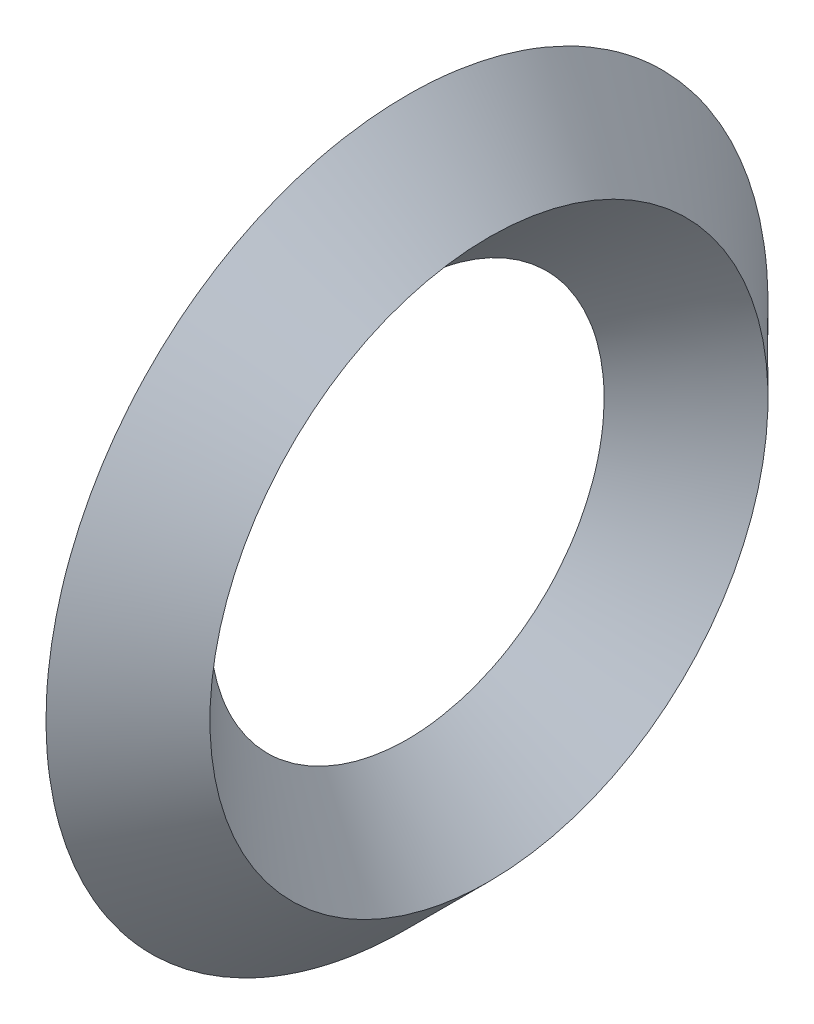
ISO-10303-21;
HEADER;
FILE_DESCRIPTION(('STEP AP214'),'2;1');
FILE_NAME('part.step','',(''),(''),'','','');
FILE_SCHEMA(('AUTOMOTIVE_DESIGN { 1 0 10303 214 1 1 1 1 }'));
ENDSEC;
DATA;
#1=APPLICATION_CONTEXT('core data for automotive mechanical design processes');
#2=APPLICATION_PROTOCOL_DEFINITION('international standard','automotive_design',2000,#1);
#3=PRODUCT_CONTEXT('',#1,'mechanical');
#4=PRODUCT('Part','Part','',(#3));
#5=PRODUCT_RELATED_PRODUCT_CATEGORY('part','',(#4));
#6=PRODUCT_DEFINITION_FORMATION('','',#4);
#7=PRODUCT_DEFINITION_CONTEXT('part definition',#1,'design');
#8=PRODUCT_DEFINITION('design','',#6,#7);
#9=PRODUCT_DEFINITION_SHAPE('','',#8);
#10=(LENGTH_UNIT() NAMED_UNIT(*) SI_UNIT(.MILLI.,.METRE.));
#11=(NAMED_UNIT(*) PLANE_ANGLE_UNIT() SI_UNIT($,.RADIAN.));
#12=(NAMED_UNIT(*) SI_UNIT($,.STERADIAN.) SOLID_ANGLE_UNIT());
#13=UNCERTAINTY_MEASURE_WITH_UNIT(LENGTH_MEASURE(1.E-05),#10,'distance_accuracy_value','');
#14=(GEOMETRIC_REPRESENTATION_CONTEXT(3) GLOBAL_UNCERTAINTY_ASSIGNED_CONTEXT((#13)) GLOBAL_UNIT_ASSIGNED_CONTEXT((#10,
#11,#12)) REPRESENTATION_CONTEXT('',''));
#15=CARTESIAN_POINT('',(0.,0.,0.));
#16=DIRECTION('',(0.,0.,1.));
#17=DIRECTION('',(1.,0.,0.));
#18=AXIS2_PLACEMENT_3D('',#15,#16,#17);
#19=CARTESIAN_POINT('',(88.4999999999999,44.0508926813987,46.4275656692434));
#20=DIRECTION('',(-1.,0.,0.));
#21=DIRECTION('',(0.,0.97238902572085,-0.233365770107049));
#22=AXIS2_PLACEMENT_3D('',#19,#20,#21);
#23=CONICAL_SURFACE('',#22,8.50000000000004,0.785398163397453);
#24=CARTESIAN_POINT('',(90.4999999999999,44.0508926813987,46.4275656692434));
#25=DIRECTION('',(1.,0.,0.));
#26=DIRECTION('',(0.,-0.97238902572085,0.233365770107049));
#27=AXIS2_PLACEMENT_3D('',#24,#25,#26);
#28=CIRCLE('',#27,6.5);
#29=CARTESIAN_POINT('',(90.4999999999999,37.7303640142132,47.9444431749392));
#30=VERTEX_POINT('',#29);
#31=EDGE_CURVE('E48',#30,#30,#28,.F.);
#32=ORIENTED_EDGE('',*,*,#31,.T.);
#33=EDGE_LOOP('',(#32));
#34=FACE_BOUND('',#33,.T.);
#35=CARTESIAN_POINT('',(88.5908116907946,35.6417043722034,46.4275656693589));
#36=CARTESIAN_POINT('',(88.5908117935183,35.6417025529571,46.6625204245041));
#37=CARTESIAN_POINT('',(88.5909903129111,35.6517341173683,46.8974451577782));
#38=CARTESIAN_POINT('',(88.5915270851731,35.6916126202227,47.3656833069674));
#39=CARTESIAN_POINT('',(88.5918853888673,35.7214651628265,47.5989962483102));
#40=CARTESIAN_POINT('',(88.592628514165,35.8006838280418,48.0625973765442));
#41=CARTESIAN_POINT('',(88.5930133704048,35.8500758519243,48.2928811276142));
#42=CARTESIAN_POINT('',(88.5936901003344,35.9679119045025,48.7485225020141));
#43=CARTESIAN_POINT('',(88.5939819729496,36.0363561533455,48.9738800683898));
#44=CARTESIAN_POINT('',(88.5943956059712,36.1918665651528,49.4184579246521));
#45=CARTESIAN_POINT('',(88.5945171079108,36.2789607915042,49.6376683962511));
#46=CARTESIAN_POINT('',(88.5945580677103,36.4710792019369,50.0680912028688));
#47=CARTESIAN_POINT('',(88.5944775215272,36.5761037447777,50.2793033777499));
#48=CARTESIAN_POINT('',(88.594131838259,36.8033152257449,50.692156138085));
#49=CARTESIAN_POINT('',(88.5938667888803,36.925493987334,50.893801222771));
#50=CARTESIAN_POINT('',(88.5932233504776,37.1862605017927,51.2861879771424));
#51=CARTESIAN_POINT('',(88.5928449614947,37.3248482486981,51.4769296507908));
#52=CARTESIAN_POINT('',(88.5920814785049,37.6191866571651,51.8481734460824));
#53=CARTESIAN_POINT('',(88.5916963568148,37.7751117428974,52.0285373872655));
#54=CARTESIAN_POINT('',(88.5911327591758,38.1018534420126,52.3752305876525));
#55=CARTESIAN_POINT('',(88.5909542798688,38.2726698133496,52.5415600748887));
#56=CARTESIAN_POINT('',(88.590808211624,38.6279588513917,52.8589768576582));
#57=CARTESIAN_POINT('',(88.590840651792,38.8124333993849,53.0100620466324));
#58=CARTESIAN_POINT('',(88.5909110564927,39.1935485054108,53.296025694256));
#59=CARTESIAN_POINT('',(88.5909490212443,39.3901895451777,53.4309035105489));
#60=CARTESIAN_POINT('',(88.5909199484937,39.7916692358965,53.6820134101824));
#61=CARTESIAN_POINT('',(88.5908541985046,39.9963770897802,53.7984546850033));
#62=CARTESIAN_POINT('',(88.5906928557904,40.4148218907859,54.013790030883));
#63=CARTESIAN_POINT('',(88.590597263586,40.6285586803246,54.1126844080339));
#64=CARTESIAN_POINT('',(88.590446993046,41.0635690280475,54.2921595017764));
#65=CARTESIAN_POINT('',(88.5903923114005,41.2848419750113,54.3727416995304));
#66=CARTESIAN_POINT('',(88.590371491757,41.7333925074914,54.5149882022783));
#67=CARTESIAN_POINT('',(88.5904053553882,41.9606702034218,54.5766521591439));
#68=CARTESIAN_POINT('',(88.5905400321984,42.4204436279788,54.6808327346117));
#69=CARTESIAN_POINT('',(88.5906410895935,42.6529553905895,54.7232785553827));
#70=CARTESIAN_POINT('',(88.5907734151149,43.1207175577709,54.7885244388753));
#71=CARTESIAN_POINT('',(88.5908046830419,43.3559679701582,54.8113244455102));
#72=CARTESIAN_POINT('',(88.5908279359625,43.8275720465709,54.8370884914812));
#73=CARTESIAN_POINT('',(88.5908199181315,44.0639257887012,54.8400511045457));
#74=CARTESIAN_POINT('',(88.590806543156,44.5360435153194,54.8260736979924));
#75=CARTESIAN_POINT('',(88.5908011860268,44.7718074963978,54.8091335635798));
#76=CARTESIAN_POINT('',(88.590702953286,45.2417188326261,54.7554875904507));
#77=CARTESIAN_POINT('',(88.59060984246,45.4758601387001,54.7187287431727));
#78=CARTESIAN_POINT('',(88.5904645502763,45.9401968400797,54.6255463644184));
#79=CARTESIAN_POINT('',(88.5904123683543,46.1703922897504,54.5691231041028));
#80=CARTESIAN_POINT('',(88.5903947098766,46.6251576404744,54.436978011009));
#81=CARTESIAN_POINT('',(88.5904292273206,46.8497279297538,54.3612575141019));
#82=CARTESIAN_POINT('',(88.5905306581666,47.2916701702566,54.1911088789451));
#83=CARTESIAN_POINT('',(88.5905975723144,47.509041955662,54.0966803101031));
#84=CARTESIAN_POINT('',(88.5907209681529,47.9344081491954,53.8901398090537));
#85=CARTESIAN_POINT('',(88.5907774805433,48.1424287366953,53.7780817849006));
#86=CARTESIAN_POINT('',(88.5908851588626,48.548306905759,53.5368699075306));
#87=CARTESIAN_POINT('',(88.5909363248615,48.7461646204687,53.4077162783662));
#88=CARTESIAN_POINT('',(88.591032845992,49.1302978497929,53.1332416122686));
#89=CARTESIAN_POINT('',(88.5910782017154,49.3165745429337,52.987922224633));
#90=CARTESIAN_POINT('',(88.5911417784243,49.6763253337487,52.6820969186211));
#91=CARTESIAN_POINT('',(88.5911599899146,49.8497949313331,52.5215857070035));
#92=CARTESIAN_POINT('',(88.5911571744421,50.1829722881246,52.1862300580103));
#93=CARTESIAN_POINT('',(88.5911360695916,50.3426520731478,52.0113578268202));
#94=CARTESIAN_POINT('',(88.5910682446411,50.6467232561822,51.6487851536203));
#95=CARTESIAN_POINT('',(88.5910215240483,50.7911143599519,51.4610844648321));
#96=CARTESIAN_POINT('',(88.5909234705253,51.063550991631,51.0741949190078));
#97=CARTESIAN_POINT('',(88.5908721379514,51.1915977802475,50.8750069497576));
#98=CARTESIAN_POINT('',(88.5907634235052,51.4304499668258,50.466546643098));
#99=CARTESIAN_POINT('',(88.5907060415741,51.5412551974503,50.25727420784));
#100=CARTESIAN_POINT('',(88.5905815792056,51.7448492243023,49.8301140958957));
#101=CARTESIAN_POINT('',(88.5905144977486,51.8376361239934,49.6122255152109));
#102=CARTESIAN_POINT('',(88.5904188506024,52.0044712657685,49.1693942877992));
#103=CARTESIAN_POINT('',(88.5903902837516,52.078520072946,48.9444518540286));
#104=CARTESIAN_POINT('',(88.5904218155123,52.2073196322286,48.4890489197901));
#105=CARTESIAN_POINT('',(88.5904819356564,52.2620656937686,48.2585870926195));
#106=CARTESIAN_POINT('',(88.5906316050224,52.3518834194576,47.793947882663));
#107=CARTESIAN_POINT('',(88.5907211440196,52.3869619078229,47.5597718176731));
#108=CARTESIAN_POINT('',(88.590810006975,52.4372902761998,47.0897948313439));
#109=CARTESIAN_POINT('',(88.5908095194702,52.4525815277454,46.8539983398391));
#110=CARTESIAN_POINT('',(88.5908179136519,52.4632643435277,46.3819544996568));
#111=CARTESIAN_POINT('',(88.5908267953006,52.4586559883397,46.1457071528088));
#112=CARTESIAN_POINT('',(88.5907938884969,52.4296328668137,45.6744443188231));
#113=CARTESIAN_POINT('',(88.590752102129,52.4052189152709,45.4394287814096));
#114=CARTESIAN_POINT('',(88.5906148579678,52.3367609325869,44.9722736486993));
#115=CARTESIAN_POINT('',(88.590519400583,52.2927170508883,44.740134031522));
#116=CARTESIAN_POINT('',(88.5904066467559,52.1850287217654,44.2797437651673));
#117=CARTESIAN_POINT('',(88.5903895743476,52.1213286475537,44.051506118224));
#118=CARTESIAN_POINT('',(88.5904287560938,51.9748335163124,43.6012428064963));
#119=CARTESIAN_POINT('',(88.5904850110522,51.8920382499393,43.3792172098456));
#120=CARTESIAN_POINT('',(88.5906045919773,51.7080075987506,42.9429462844878));
#121=CARTESIAN_POINT('',(88.5906679179359,51.6067722349275,42.7287009469239));
#122=CARTESIAN_POINT('',(88.5907849209094,51.38659475522,42.3095048291721));
#123=CARTESIAN_POINT('',(88.5908385977313,51.2676522854305,42.1045542348615));
#124=CARTESIAN_POINT('',(88.5909429931669,51.0132656991286,41.70598374619));
#125=CARTESIAN_POINT('',(88.5909937197504,50.8778694158409,41.5123333202425));
#126=CARTESIAN_POINT('',(88.591081959623,50.5912762321535,41.1371007142844));
#127=CARTESIAN_POINT('',(88.5911194728967,50.4400793133108,40.9555185483606));
#128=CARTESIAN_POINT('',(88.5911603717235,50.1229657430023,40.6056888451249));
#129=CARTESIAN_POINT('',(88.5911637563049,49.9570486725782,40.4374416876061));
#130=CARTESIAN_POINT('',(88.5911340677189,49.6116757782323,40.1154778809732));
#131=CARTESIAN_POINT('',(88.5911009953517,49.4322202515993,39.9617609129599));
#132=CARTESIAN_POINT('',(88.5910176420581,49.0605389653599,39.6695738351042));
#133=CARTESIAN_POINT('',(88.5909673164999,48.8682811377594,39.5311445126612));
#134=CARTESIAN_POINT('',(88.5908643228784,48.4727741056422,39.2709914483419));
#135=CARTESIAN_POINT('',(88.5908116547901,48.2695247838421,39.1492678847714));
#136=CARTESIAN_POINT('',(88.5906976301344,47.8534975088523,38.9233945108209));
#137=CARTESIAN_POINT('',(88.5906362739664,47.6407199937852,38.8192438934549));
#138=CARTESIAN_POINT('',(88.5905130625128,47.2071417944723,38.6292593095936));
#139=CARTESIAN_POINT('',(88.5904512072352,46.9863412368263,38.5434250542217));
#140=CARTESIAN_POINT('',(88.5903917461452,46.5385492810451,38.3908402800253));
#141=CARTESIAN_POINT('',(88.5903940598295,46.3115659967652,38.3240659558583));
#142=CARTESIAN_POINT('',(88.5904845346928,45.8527632044878,38.2099568904693));
#143=CARTESIAN_POINT('',(88.5905726969289,45.6209436369694,38.1626223886442));
#144=CARTESIAN_POINT('',(88.590719077823,45.1541397663545,38.0876173828167));
#145=CARTESIAN_POINT('',(88.5907772954045,44.9191553498006,38.0599475857002));
#146=CARTESIAN_POINT('',(88.5908240913755,44.4476924713266,38.0244309703474));
#147=CARTESIAN_POINT('',(88.5908126701842,44.2112140184121,38.0165840327386));
#148=CARTESIAN_POINT('',(88.5908126572246,43.7385339547853,38.0208598526912));
#149=CARTESIAN_POINT('',(88.5908240562356,43.5023322708283,38.0329745443173));
#150=CARTESIAN_POINT('',(88.5907574016242,43.03177504204,38.0769608326292));
#151=CARTESIAN_POINT('',(88.5906793472286,42.7974195131819,38.1088326000653));
#152=CARTESIAN_POINT('',(88.5905196053073,42.3322160172898,38.1921936871552));
#153=CARTESIAN_POINT('',(88.5904379177235,42.1013681064012,38.243683320484));
#154=CARTESIAN_POINT('',(88.590365660804,41.6448594995226,38.3660029674466));
#155=CARTESIAN_POINT('',(88.5903750891729,41.4191986729956,38.4368324937983));
#156=CARTESIAN_POINT('',(88.5904686134763,40.9746690590104,38.5973097834814));
#157=CARTESIAN_POINT('',(88.5905527103351,40.7558003556658,38.6869577797536));
#158=CARTESIAN_POINT('',(88.5907263120679,40.3263847243979,38.8843720946667));
#159=CARTESIAN_POINT('',(88.5908158171491,40.1158381158252,38.9921391077714));
#160=CARTESIAN_POINT('',(88.5909288308892,39.7045577159301,39.2249493109956));
#161=CARTESIAN_POINT('',(88.5909523471069,39.5038228032879,39.349990520672));
#162=CARTESIAN_POINT('',(88.5909122748714,39.1135456573453,39.6164578845968));
#163=CARTESIAN_POINT('',(88.590848689004,38.9240030919439,39.7578835523139));
#164=CARTESIAN_POINT('',(88.5908278204113,38.5573084814586,40.0564831756846));
#165=CARTESIAN_POINT('',(88.5908706858057,38.3801740539796,40.2136787821654));
#166=CARTESIAN_POINT('',(88.5912102281549,38.0399737040113,40.5426201641219));
#167=CARTESIAN_POINT('',(88.5915069058281,37.8769078213352,40.7143659807711));
#168=CARTESIAN_POINT('',(88.5922029736889,37.5658765790367,41.0711082693009));
#169=CARTESIAN_POINT('',(88.5926023941742,37.4179156916993,41.2561086381552));
#170=CARTESIAN_POINT('',(88.5933424422341,37.138079659541,41.6378970607715));
#171=CARTESIAN_POINT('',(88.5936830695407,37.0062045880672,41.8346851682765));
#172=CARTESIAN_POINT('',(88.594209381943,36.7599703652157,42.2376655381609));
#173=CARTESIAN_POINT('',(88.5943957833863,36.6455322694938,42.4438095768735));
#174=CARTESIAN_POINT('',(88.5945700017293,36.4341906283492,42.8648980607446));
#175=CARTESIAN_POINT('',(88.5945578176322,36.3372871709355,43.0798425500671));
#176=CARTESIAN_POINT('',(88.5943397667159,36.1617790345167,43.5168289623382));
#177=CARTESIAN_POINT('',(88.5941340959542,36.0831559328181,43.7388634810632));
#178=CARTESIAN_POINT('',(88.5935823674658,35.9446958268221,44.1886379776625));
#179=CARTESIAN_POINT('',(88.5932363456047,35.8848540300273,44.416376483986));
#180=CARTESIAN_POINT('',(88.5923993435129,35.770793174954,44.9385473372328));
#181=CARTESIAN_POINT('',(88.5918945152347,35.7225136274134,45.2342971583439));
#182=CARTESIAN_POINT('',(88.5911006414703,35.6579730536065,45.8292364857875));
#183=CARTESIAN_POINT('',(88.5908115600086,35.6417066884359,46.1284254102009));
#184=CARTESIAN_POINT('',(88.5908116907946,35.6417043722034,46.4275656693589));
#185=B_SPLINE_CURVE_WITH_KNOTS('',3,(#35,#36,#37,#38,#39,#40,#41,#42,#43,#44,#45,#46,#47,#48,
#49,#50,#51,#52,#53,#54,#55,#56,#57,#58,#59,#60,#61,#62,#63,#64,#65,#66,#67,#68,#69,#70,#71,#72,
#73,#74,#75,#76,#77,#78,#79,#80,#81,#82,#83,#84,#85,#86,#87,#88,#89,#90,#91,#92,#93,#94,#95,#96,
#97,#98,#99,#100,#101,#102,#103,#104,#105,#106,#107,#108,#109,#110,#111,#112,#113,#114,#115,
#116,#117,#118,#119,#120,#121,#122,#123,#124,#125,#126,#127,#128,#129,#130,#131,#132,#133,#134,
#135,#136,#137,#138,#139,#140,#141,#142,#143,#144,#145,#146,#147,#148,#149,#150,#151,#152,#153,
#154,#155,#156,#157,#158,#159,#160,#161,#162,#163,#164,#165,#166,#167,#168,#169,#170,#171,#172,
#173,#174,#175,#176,#177,#178,#179,#180,#181,#182,#183,#184),.UNSPECIFIED.,.T.,.F.,(4,2,2,2,2,2,
2,2,2,2,2,2,2,2,2,2,2,2,2,2,2,2,2,2,2,2,2,2,2,2,2,2,2,2,2,2,2,2,2,2,2,2,2,2,2,2,2,2,2,2,2,2,2,2,
2,2,2,2,2,2,2,2,2,2,2,2,2,2,2,2,2,2,2,2,4),(0.,0.704603104754758,1.40940551306724,
2.11514534541957,2.82089333289051,3.52771084598584,4.23454250313332,4.94103838644484,
5.6475340129716,6.36192148970062,7.07629735679744,7.79077180631466,8.50527456368982,
9.21097706583816,9.91666725634024,10.6223003474613,11.3279464226642,12.0361712936361,
12.7443981865062,13.4526759990232,14.1609578967547,14.8711436831074,15.5813196768021,
16.2914465211776,17.001589712009,17.7096021578051,18.4176053254152,19.1255363257487,
19.8337149028249,20.5432979119993,21.2528945751171,21.9624364708908,22.6719852526677,
23.3816086782371,24.0912107008065,24.8009850379421,25.5105129463085,26.2185549503286,
26.9265940874268,27.6346040975241,28.3426087176382,29.0526356487227,29.7626703643171,
30.4727042716023,31.182752371974,31.8907835552176,32.5988155649036,33.3068677327441,
34.0149043570993,34.7247865731038,35.4346763653212,36.1445335490558,36.8543795364447,
37.563335026611,38.2722992471311,38.9812889514535,39.6902743862563,40.3989734101519,
41.10767855906,41.8163950401059,42.5250936661914,43.2338010652865,43.9425356338411,
44.6511890150902,45.359821358492,46.0694402679109,46.7790611854459,47.4888916017829,
48.1987252546401,48.9052430668537,49.6117644250912,50.3175706442791,51.0231966134869,
51.9204345326789,52.8175228049705),.UNSPECIFIED.);
#186=CARTESIAN_POINT('',(88.5908116907946,35.6417043722034,46.4275656693589));
#187=VERTEX_POINT('',#186);
#188=EDGE_CURVE('E43',#187,#187,#185,.T.);
#189=ORIENTED_EDGE('',*,*,#188,.F.);
#190=EDGE_LOOP('',(#189));
#191=FACE_BOUND('',#190,.T.);
#192=ADVANCED_FACE('F29',(#34,#191),#23,.T.);
#193=CARTESIAN_POINT('',(90.4999999999999,44.0508926813987,46.4275656692434));
#194=DIRECTION('',(1.,0.,0.));
#195=DIRECTION('',(0.,0.0215665250746254,-0.999767415450317));
#196=AXIS2_PLACEMENT_3D('',#193,#194,#195);
#197=CONICAL_SURFACE('',#196,6.5,0.78539816339745);
#198=ORIENTED_EDGE('',*,*,#31,.F.);
#199=EDGE_LOOP('',(#198));
#200=FACE_BOUND('',#199,.T.);
#201=CARTESIAN_POINT('',(88.5908116907963,39.4600809906024,46.4275656692434));
#202=CARTESIAN_POINT('',(88.5908119411021,39.4600846455442,46.2002224364382));
#203=CARTESIAN_POINT('',(88.5905084045148,39.4773112733539,45.9728283979354));
#204=CARTESIAN_POINT('',(88.589810887685,39.5453522931056,45.5229612482266));
#205=CARTESIAN_POINT('',(88.5894168168113,39.5962004390655,45.3004933147449));
#206=CARTESIAN_POINT('',(88.5888517489912,39.738699999061,44.8374347634122));
#207=CARTESIAN_POINT('',(88.5887159441236,39.8347567326698,44.598191245327));
#208=CARTESIAN_POINT('',(88.5889050039181,40.0652170146271,44.1388079335709));
#209=CARTESIAN_POINT('',(88.5892298898335,40.1996223319045,43.9186690217609));
#210=CARTESIAN_POINT('',(88.5898293317073,40.428137775931,43.6063612749577));
#211=CARTESIAN_POINT('',(88.5900497455935,40.5094492419562,43.5046049446382));
#212=CARTESIAN_POINT('',(88.5904328919792,40.6804537286773,43.3084122542488));
#213=CARTESIAN_POINT('',(88.5905956454981,40.7701436799942,43.2139732365653));
#214=CARTESIAN_POINT('',(88.5907808948896,40.9573258496304,43.033149866528));
#215=CARTESIAN_POINT('',(88.5908033650628,41.0548194942483,42.9467669928892));
#216=CARTESIAN_POINT('',(88.5907906159992,41.2568289056442,42.7826375767894));
#217=CARTESIAN_POINT('',(88.5907553944934,41.3613449484666,42.7048913741477));
#218=CARTESIAN_POINT('',(88.5907348344826,41.5751364089644,42.5594955777145));
#219=CARTESIAN_POINT('',(88.5907488358441,41.6843295889318,42.4917249728427));
#220=CARTESIAN_POINT('',(88.5908116079427,41.9079962801438,42.3655424472338));
#221=CARTESIAN_POINT('',(88.5908603783528,42.0224697416989,42.3071304384516));
#222=CARTESIAN_POINT('',(88.5909545896357,42.2559074442271,42.2001103868917));
#223=CARTESIAN_POINT('',(88.5910000306248,42.3748715282705,42.1515020018915));
#224=CARTESIAN_POINT('',(88.5910503146133,42.6164679180332,42.0644641718899));
#225=CARTESIAN_POINT('',(88.5910551574992,42.7391002340084,42.0260347553505));
#226=CARTESIAN_POINT('',(88.5910154829093,42.9877912619318,41.9594685872381));
#227=CARTESIAN_POINT('',(88.5909707160009,43.113864151491,41.9313848021737));
#228=CARTESIAN_POINT('',(88.5908834811628,43.3679247119826,41.885933867301));
#229=CARTESIAN_POINT('',(88.5908410132319,43.4959123817592,41.8685667110237));
#230=CARTESIAN_POINT('',(88.5908048520504,43.7529033299982,41.8446248130738));
#231=CARTESIAN_POINT('',(88.5908111623078,43.8819066808385,41.8380508476523));
#232=CARTESIAN_POINT('',(88.5908112139395,44.1400082738235,41.8358055152162));
#233=CARTESIAN_POINT('',(88.5908049553357,44.2691065158022,41.8401341291687));
#234=CARTESIAN_POINT('',(88.5908307269672,44.5265940855026,41.8596208949807));
#235=CARTESIAN_POINT('',(88.5908627902542,44.6549827051927,41.8747883905551));
#236=CARTESIAN_POINT('',(88.5909429050016,44.9100278100981,41.9158778242437));
#237=CARTESIAN_POINT('',(88.5909909562936,45.0366843135612,41.9417996489708));
#238=CARTESIAN_POINT('',(88.5910399663532,45.2873399736308,42.0042719171584));
#239=CARTESIAN_POINT('',(88.5910409283782,45.4113393134488,42.0408216252778));
#240=CARTESIAN_POINT('',(88.5910080204193,45.6558032158133,42.1242763546183));
#241=CARTESIAN_POINT('',(88.5909741500873,45.776267743023,42.1711814793204));
#242=CARTESIAN_POINT('',(88.590906894715,46.0125816419871,42.2748774679582));
#243=CARTESIAN_POINT('',(88.5908735088541,46.1284395915449,42.33164878811));
#244=CARTESIAN_POINT('',(88.5908114345787,46.3550118866956,42.4547564764934));
#245=CARTESIAN_POINT('',(88.5907827478732,46.4657243507331,42.5210963078278));
#246=CARTESIAN_POINT('',(88.5907266618925,46.6811410943615,42.6628368187565));
#247=CARTESIAN_POINT('',(88.590699262235,46.7858471607824,42.7382347827964));
#248=CARTESIAN_POINT('',(88.5906537926414,46.988587867493,42.8975967493758));
#249=CARTESIAN_POINT('',(88.5906357262478,47.0866199624254,42.981563989941));
#250=CARTESIAN_POINT('',(88.5906195055727,47.2753948142694,43.1575435739517));
#251=CARTESIAN_POINT('',(88.5906213750933,47.366128727422,43.2495654040972));
#252=CARTESIAN_POINT('',(88.5906438031944,47.5395626166083,43.4409496710257));
#253=CARTESIAN_POINT('',(88.590664368193,47.6222598228193,43.5403146179634));
#254=CARTESIAN_POINT('',(88.5907126800134,47.7789533145192,43.7456122289446));
#255=CARTESIAN_POINT('',(88.5907404235801,47.852953521559,43.8515418997339));
#256=CARTESIAN_POINT('',(88.5907974701682,47.9917975929153,44.0693094035105));
#257=CARTESIAN_POINT('',(88.5908267738989,48.0566372424696,44.1811499237656));
#258=CARTESIAN_POINT('',(88.5908906737484,48.1766772323414,44.4099258815456));
#259=CARTESIAN_POINT('',(88.5909252712143,48.2318751112224,44.5268626105834));
#260=CARTESIAN_POINT('',(88.5909904820374,48.3322099992816,44.7649753243536));
#261=CARTESIAN_POINT('',(88.5910210954211,48.3773470759167,44.886151280656));
#262=CARTESIAN_POINT('',(88.5910421866798,48.4572056251526,45.1318933950499));
#263=CARTESIAN_POINT('',(88.5910326632423,48.4919267571518,45.2564596638596));
#264=CARTESIAN_POINT('',(88.5909707650358,48.5506993375564,45.5080846844439));
#265=CARTESIAN_POINT('',(88.5909183897344,48.5747506534012,45.6351434671648));
#266=CARTESIAN_POINT('',(88.5908436335596,48.6120315329414,45.8904816877863));
#267=CARTESIAN_POINT('',(88.5908211709408,48.6252905510777,46.0187568301602));
#268=CARTESIAN_POINT('',(88.5908034601536,48.6410009325314,46.2759653471262));
#269=CARTESIAN_POINT('',(88.5908082112965,48.6434525693237,46.4048987049799));
#270=CARTESIAN_POINT('',(88.5908128985937,48.6374995930096,46.662513277659));
#271=CARTESIAN_POINT('',(88.590812834768,48.6290950252811,46.7911944935359));
#272=CARTESIAN_POINT('',(88.5908616406127,48.601542587984,47.0474015169098));
#273=CARTESIAN_POINT('',(88.5909105103457,48.5823947046344,47.1749273229245));
#274=CARTESIAN_POINT('',(88.5909921551211,48.5333328296649,47.4283983197173));
#275=CARTESIAN_POINT('',(88.5910248680566,48.5033780476449,47.5543356252796));
#276=CARTESIAN_POINT('',(88.5910417573854,48.4328986313369,47.8032166806547));
#277=CARTESIAN_POINT('',(88.5910259337846,48.3923739983075,47.9261604308241));
#278=CARTESIAN_POINT('',(88.5909734172429,48.3010736170424,48.1681763380639));
#279=CARTESIAN_POINT('',(88.5909367247951,48.2502981110442,48.2872485865443));
#280=CARTESIAN_POINT('',(88.5908686979981,48.1388807308365,48.5206868382704));
#281=CARTESIAN_POINT('',(88.5908373637624,48.0782386474136,48.6350527416571));
#282=CARTESIAN_POINT('',(88.5907780962013,47.9477696954156,48.8578315938839));
#283=CARTESIAN_POINT('',(88.5907501503197,47.8779788640934,48.9662656491181));
#284=CARTESIAN_POINT('',(88.5906968083165,47.7295281808831,49.1768814121064));
#285=CARTESIAN_POINT('',(88.5906714121781,47.6508683870901,49.2790631608088));
#286=CARTESIAN_POINT('',(88.5906345594419,47.4852418416069,49.4764624886983));
#287=CARTESIAN_POINT('',(88.5906231033561,47.3982747849272,49.5716798119697));
#288=CARTESIAN_POINT('',(88.5906215795935,47.2166555458196,49.7544789993895));
#289=CARTESIAN_POINT('',(88.5906315119415,47.1220033545155,49.842060854719));
#290=CARTESIAN_POINT('',(88.5906662400545,46.9253990962671,50.0092026999608));
#291=CARTESIAN_POINT('',(88.5906910778593,46.8234271032409,50.0887392544542));
#292=CARTESIAN_POINT('',(88.5907439213871,46.6131397922272,50.2389321236754));
#293=CARTESIAN_POINT('',(88.5907719271239,46.5048244468034,50.30958839999));
#294=CARTESIAN_POINT('',(88.5908308913442,46.2826277957177,50.441513822967));
#295=CARTESIAN_POINT('',(88.5908618496842,46.1687467608864,50.502783425793));
#296=CARTESIAN_POINT('',(88.5909293460881,45.9362281364575,50.6155048828397));
#297=CARTESIAN_POINT('',(88.590965884027,45.8175906534236,50.6669569568642));
#298=CARTESIAN_POINT('',(88.5910209909189,45.5764781017049,50.7596242615826));
#299=CARTESIAN_POINT('',(88.591039572538,45.4540058010718,50.8008466927841));
#300=CARTESIAN_POINT('',(88.5910294405149,45.2060112613398,50.872778957747));
#301=CARTESIAN_POINT('',(88.591000726767,45.0804890154253,50.9034887680135));
#302=CARTESIAN_POINT('',(88.5909213370228,44.8272959003269,50.9542010068461));
#303=CARTESIAN_POINT('',(88.5908706600008,44.6996249310784,50.9742029353221));
#304=CARTESIAN_POINT('',(88.5908172309378,44.4430550360676,51.0034242759646));
#305=CARTESIAN_POINT('',(88.5908144788967,44.3141561103086,51.0126436881598));
#306=CARTESIAN_POINT('',(88.5908072471711,44.0561777128965,51.0201812203164));
#307=CARTESIAN_POINT('',(88.5908027693454,43.9270985838854,51.0185110389138));
#308=CARTESIAN_POINT('',(88.5908156621441,43.669537174397,51.004332167784));
#309=CARTESIAN_POINT('',(88.5908330329599,43.5410548991593,50.991823383087));
#310=CARTESIAN_POINT('',(88.5909056101391,43.2855931379944,50.956071523806));
#311=CARTESIAN_POINT('',(88.5909608160157,43.1586136327532,50.9328285873339));
#312=CARTESIAN_POINT('',(88.5910342156028,42.907073020109,50.8757006985296));
#313=CARTESIAN_POINT('',(88.5910524101967,42.7825118550514,50.8418160002351));
#314=CARTESIAN_POINT('',(88.5910400668385,42.5366205062719,50.7636104497024));
#315=CARTESIAN_POINT('',(88.5910094969498,42.4152924929066,50.71928277441));
#316=CARTESIAN_POINT('',(88.5909264225941,42.1768084261251,50.6205443356302));
#317=CARTESIAN_POINT('',(88.5908739175445,42.059652483604,50.5661333043617));
#318=CARTESIAN_POINT('',(88.5907861285757,41.8303402182273,50.4476550181888));
#319=CARTESIAN_POINT('',(88.5907508435901,41.7181835861452,50.3835883615987));
#320=CARTESIAN_POINT('',(88.5907371017266,41.4996336921698,50.2462826278188));
#321=CARTESIAN_POINT('',(88.5907586446311,41.3932404082019,50.1730435857643));
#322=CARTESIAN_POINT('',(88.5907967187778,41.1869053678095,50.0177850731715));
#323=CARTESIAN_POINT('',(88.5908132453269,41.0869697212779,49.9357574768424));
#324=CARTESIAN_POINT('',(88.5907320872226,40.8944519293974,49.7634897815342));
#325=CARTESIAN_POINT('',(88.5906344055562,40.8018695917939,49.6732498974004));
#326=CARTESIAN_POINT('',(88.5903285530462,40.6247126296161,49.4851935757194));
#327=CARTESIAN_POINT('',(88.5901203669459,40.5401391126726,49.3873760935712));
#328=CARTESIAN_POINT('',(88.5897039415374,40.3795554504996,49.1849876244553));
#329=CARTESIAN_POINT('',(88.589495702228,40.3035455051074,49.0804164799754));
#330=CARTESIAN_POINT('',(88.5889742246956,40.0899511911808,48.7589636497792));
#331=CARTESIAN_POINT('',(88.5887601057544,39.9656084525057,48.5330685088284));
#332=CARTESIAN_POINT('',(88.5888018245353,39.7561195442757,48.0640250820417));
#333=CARTESIAN_POINT('',(88.5890573663398,39.6709487360656,47.8208877527252));
#334=CARTESIAN_POINT('',(88.5896985598151,39.5581585381441,47.3856624867044));
#335=CARTESIAN_POINT('',(88.5900362108787,39.5215037581537,47.1958726918435));
#336=CARTESIAN_POINT('',(88.5905926397989,39.4724696461661,46.8132549382306));
#337=CARTESIAN_POINT('',(88.5908114784534,39.4600778899922,46.6204285854051));
#338=CARTESIAN_POINT('',(88.5908116907963,39.4600809906024,46.4275656692434));
#339=B_SPLINE_CURVE_WITH_KNOTS('',3,(#201,#202,#203,#204,#205,#206,#207,#208,#209,#210,#211,
#212,#213,#214,#215,#216,#217,#218,#219,#220,#221,#222,#223,#224,#225,#226,#227,#228,#229,#230,
#231,#232,#233,#234,#235,#236,#237,#238,#239,#240,#241,#242,#243,#244,#245,#246,#247,#248,#249,
#250,#251,#252,#253,#254,#255,#256,#257,#258,#259,#260,#261,#262,#263,#264,#265,#266,#267,#268,
#269,#270,#271,#272,#273,#274,#275,#276,#277,#278,#279,#280,#281,#282,#283,#284,#285,#286,#287,
#288,#289,#290,#291,#292,#293,#294,#295,#296,#297,#298,#299,#300,#301,#302,#303,#304,#305,#306,
#307,#308,#309,#310,#311,#312,#313,#314,#315,#316,#317,#318,#319,#320,#321,#322,#323,#324,#325,
#326,#327,#328,#329,#330,#331,#332,#333,#334,#335,#336,#337,#338),.UNSPECIFIED.,.T.,.F.,(4,2,2,
2,2,2,2,2,2,2,2,2,2,2,2,2,2,2,2,2,2,2,2,2,2,2,2,2,2,2,2,2,2,2,2,2,2,2,2,2,2,2,2,2,2,2,2,2,2,2,2,
2,2,2,2,2,2,2,2,2,2,2,2,2,2,2,2,2,4),(0.,0.681486719664657,1.3636586526511,2.1335319129396,
2.90344069138904,3.29380855428067,3.68403396625321,4.07433086418109,4.46464311333637,
4.84974092349436,5.2348351104626,5.61991585233077,6.00499767093177,6.39202445932216,
6.77905101408095,7.16610540274185,7.55315911571645,7.94054689350699,8.32793058701852,
8.7152874839058,9.10264825179889,9.48925027174067,9.87599256614976,10.2626192063485,
10.6493924838034,11.0366275958662,11.4239956973418,11.811188455603,12.1985587846633,
12.586027860973,12.9734943392524,13.3609734863143,13.7484574472421,14.1348803035477,
14.5212933815799,14.9077048444502,15.2941168029881,15.6820027914233,16.0698887336725,
16.4577655108942,16.8456505138261,17.2320511242482,17.6184492037457,18.004861474758,
18.3912741920722,18.778781913829,19.1662913117658,19.5537818719564,19.9412637556384,
20.3284721174558,20.7156813446548,21.1029086541084,21.4901359625309,21.8769473431794,
22.2637621131693,22.6505719063115,23.0373724663251,23.424426451828,23.8114907176957,
24.1985310088435,24.5855698174632,24.9729696170922,25.3603592846894,25.7478024507977,
26.1352546563115,26.904986615101,27.6742337577354,28.2526581458584,28.8307862671939),.UNSPECIFIED.);
#340=CARTESIAN_POINT('',(88.5908116907963,39.4600809906024,46.4275656692434));
#341=VERTEX_POINT('',#340);
#342=EDGE_CURVE('E10',#341,#341,#339,.T.);
#343=ORIENTED_EDGE('',*,*,#342,.F.);
#344=EDGE_LOOP('',(#343));
#345=FACE_BOUND('',#344,.T.);
#346=ADVANCED_FACE('F54',(#200,#345),#197,.F.);
#347=CARTESIAN_POINT('',(88.6006431135879,39.4969773742448,46.4275656692411));
#348=CARTESIAN_POINT('',(88.6006431135879,39.4969773742443,47.6216418715797));
#349=CARTESIAN_POINT('',(88.600643113588,40.1348150190649,49.1142371244713));
#350=CARTESIAN_POINT('',(88.6006431135879,41.4887865046852,50.2251847448447));
#351=CARTESIAN_POINT('',(88.6006431135879,42.2660338543293,50.6493532077734));
#352=CARTESIAN_POINT('',(88.6006431135879,43.1211777204837,50.9176559133339));
#353=CARTESIAN_POINT('',(88.6006431135879,44.0508925730864,51.0133797834491));
#354=CARTESIAN_POINT('',(88.6006431135879,44.9806080758637,50.9177108112533));
#355=CARTESIAN_POINT('',(88.6006431135879,45.8357499917184,50.6491336159354));
#356=CARTESIAN_POINT('',(88.6006431135879,46.6130044929206,50.226008213702));
#357=CARTESIAN_POINT('',(88.6006431135879,47.2899635801647,49.6666366499134));
#358=CARTESIAN_POINT('',(88.6006431135879,47.8493355311204,48.9896774564312));
#359=CARTESIAN_POINT('',(88.6006431135879,48.2724594903462,48.2124229929014));
#360=CARTESIAN_POINT('',(88.6006431135879,48.5410420698115,47.3572810330637));
#361=CARTESIAN_POINT('',(88.6006431135879,48.6366909479169,46.427565669305));
#362=CARTESIAN_POINT('',(88.6006431135879,48.5410420698365,45.4978503056028));
#363=CARTESIAN_POINT('',(88.600643113588,48.2724594904731,44.6427083459129));
#364=CARTESIAN_POINT('',(88.600643113588,47.8493355314028,43.8654538824923));
#365=CARTESIAN_POINT('',(88.600643113588,47.2899635805719,43.1884946889807));
#366=CARTESIAN_POINT('',(88.600643113588,46.6130044933573,42.6291231250671));
#367=CARTESIAN_POINT('',(88.600643113588,45.8357499920457,42.2059977226783));
#368=CARTESIAN_POINT('',(88.6006431135879,44.9806080760436,41.9374205272585));
#369=CARTESIAN_POINT('',(88.600643113588,44.0508925731564,41.8417515550323));
#370=CARTESIAN_POINT('',(88.600643113588,43.121177720508,41.9374754251495));
#371=CARTESIAN_POINT('',(88.600643113588,42.266033854374,42.2057781306961));
#372=CARTESIAN_POINT('',(88.6006431135879,41.4887865047446,42.6299465936035));
#373=CARTESIAN_POINT('',(88.6006431135881,40.1348150190923,43.7408942139632));
#374=CARTESIAN_POINT('',(88.600643113588,39.4969773742452,45.233489466873));
#375=CARTESIAN_POINT('',(88.6006431135879,39.4969773742448,46.4275656692411));
#376=CARTESIAN_POINT('',(88.5973659726574,39.4846785796973,46.4275656692419));
#377=CARTESIAN_POINT('',(88.5973659726574,39.484678579697,47.624866867393));
#378=CARTESIAN_POINT('',(88.5973659726575,40.1242395328514,49.1214933650501));
#379=CARTESIAN_POINT('',(88.5973659726574,41.4818664858725,50.2354406950721));
#380=CARTESIAN_POINT('',(88.5973659726574,42.2612124185674,50.6607548031012));
#381=CARTESIAN_POINT('',(88.5973659726574,43.1186656416411,50.9297822642048));
#382=CARTESIAN_POINT('',(88.5973659726574,44.0508925727902,51.0257647623344));
#383=CARTESIAN_POINT('',(88.5973659726574,44.9831201558902,50.9298373121261));
#384=CARTESIAN_POINT('',(88.5973659726574,45.8405714233346,50.6605346112563));
#385=CARTESIAN_POINT('',(88.5973659726574,46.6199245271278,50.2362664139572));
#386=CARTESIAN_POINT('',(88.5973659726574,47.2987112752394,49.6753843452159));
#387=CARTESIAN_POINT('',(88.5973659726574,47.8595937322069,48.9965974905762));
#388=CARTESIAN_POINT('',(88.5973659726574,48.2838604825571,48.2172444245573));
#389=CARTESIAN_POINT('',(88.5973659726574,48.5531685822867,47.3597931130083));
#390=CARTESIAN_POINT('',(88.5973659726573,48.6490758835005,46.4275656693053));
#391=CARTESIAN_POINT('',(88.5973659726573,48.5531685823119,45.4953382256591));
#392=CARTESIAN_POINT('',(88.5973659726574,48.2838604826846,44.6378869142584));
#393=CARTESIAN_POINT('',(88.5973659726575,47.8595937324905,43.8585338483492));
#394=CARTESIAN_POINT('',(88.5973659726574,47.2987112756484,43.17974699368));
#395=CARTESIAN_POINT('',(88.5973659726574,46.6199245275664,42.6188649248132));
#396=CARTESIAN_POINT('',(88.5973659726575,45.8405714236634,42.194596727358));
#397=CARTESIAN_POINT('',(88.5973659726574,44.9831201560708,41.9252940263859));
#398=CARTESIAN_POINT('',(88.5973659726575,44.0508925728603,41.8293665761469));
#399=CARTESIAN_POINT('',(88.5973659726574,43.1186656416648,41.9253490742787));
#400=CARTESIAN_POINT('',(88.5973659726574,42.261212418611,42.1943765353686));
#401=CARTESIAN_POINT('',(88.5973659726574,41.4818664859307,42.619690643377));
#402=CARTESIAN_POINT('',(88.5973659726575,40.1242395328781,43.7336379733856));
#403=CARTESIAN_POINT('',(88.5973659726574,39.4846785796976,45.2302644710612));
#404=CARTESIAN_POINT('',(88.5973659726574,39.4846785796973,46.4275656692419));
#405=CARTESIAN_POINT('',(88.5940888317269,39.4723797851498,46.4275656692426));
#406=CARTESIAN_POINT('',(88.5940888317268,39.4723797851497,47.6280918632063));
#407=CARTESIAN_POINT('',(88.5940888317269,40.1136640466378,49.1287496056289));
#408=CARTESIAN_POINT('',(88.5940888317269,41.4749464670599,50.2456966452994));
#409=CARTESIAN_POINT('',(88.5940888317268,42.2563909828054,50.6721563984291));
#410=CARTESIAN_POINT('',(88.5940888317268,43.1161535627985,50.9419086150756));
#411=CARTESIAN_POINT('',(88.5940888317268,44.050892572494,51.0381497412197));
#412=CARTESIAN_POINT('',(88.5940888317268,44.9856322359166,50.9419638129988));
#413=CARTESIAN_POINT('',(88.5940888317268,45.8453928549508,50.6719356065772));
#414=CARTESIAN_POINT('',(88.5940888317268,46.626844561335,50.2465246142124));
#415=CARTESIAN_POINT('',(88.5940888317269,47.3074589703141,49.6841320405184));
#416=CARTESIAN_POINT('',(88.5940888317269,47.8698519332934,49.0035175247213));
#417=CARTESIAN_POINT('',(88.5940888317268,48.295261474768,48.2220658562132));
#418=CARTESIAN_POINT('',(88.5940888317269,48.565295094762,47.3623051929528));
#419=CARTESIAN_POINT('',(88.5940888317268,48.661460819084,46.4275656693056));
#420=CARTESIAN_POINT('',(88.5940888317268,48.5652950947872,45.4928261457153));
#421=CARTESIAN_POINT('',(88.5940888317269,48.2952614748961,44.633065482604));
#422=CARTESIAN_POINT('',(88.5940888317269,47.8698519335783,43.8516138142061));
#423=CARTESIAN_POINT('',(88.5940888317269,47.3074589707249,43.1709992983792));
#424=CARTESIAN_POINT('',(88.5940888317269,46.6268445617756,42.6086067245593));
#425=CARTESIAN_POINT('',(88.5940888317269,45.8453928552811,42.1831957320377));
#426=CARTESIAN_POINT('',(88.5940888317269,44.9856322360981,41.9131675255132));
#427=CARTESIAN_POINT('',(88.5940888317269,44.0508925725642,41.8169815972615));
#428=CARTESIAN_POINT('',(88.5940888317269,43.1161535628217,41.9132227234079));
#429=CARTESIAN_POINT('',(88.5940888317269,42.2563909828481,42.1829749400411));
#430=CARTESIAN_POINT('',(88.5940888317269,41.4749464671167,42.6094346931506));
#431=CARTESIAN_POINT('',(88.594088831727,40.1136640466639,43.7263817328079));
#432=CARTESIAN_POINT('',(88.5940888317269,39.47237978515,45.2270394752493));
#433=CARTESIAN_POINT('',(88.5940888317269,39.4723797851498,46.4275656692426));
#434=CARTESIAN_POINT('',(88.5908116907963,39.4600809906024,46.4275656692434));
#435=CARTESIAN_POINT('',(88.5908116907963,39.4600809906024,47.6313168590195));
#436=CARTESIAN_POINT('',(88.5908116907964,40.1030885604242,49.1360058462077));
#437=CARTESIAN_POINT('',(88.5908116907963,41.4680264482473,50.2559525955268));
#438=CARTESIAN_POINT('',(88.5908116907963,42.2515695470435,50.683557993757));
#439=CARTESIAN_POINT('',(88.5908116907963,43.1136414839558,50.9540349659465));
#440=CARTESIAN_POINT('',(88.5908116907963,44.0508925721978,51.0505347201051));
#441=CARTESIAN_POINT('',(88.5908116907963,44.9881443159431,50.9540903138716));
#442=CARTESIAN_POINT('',(88.5908116907963,45.850214286567,50.6833366018981));
#443=CARTESIAN_POINT('',(88.5908116907963,46.6337645955422,50.2567828144676));
#444=CARTESIAN_POINT('',(88.5908116907963,47.3162066653888,49.6928797358209));
#445=CARTESIAN_POINT('',(88.5908116907963,47.88011013438,49.0104375588663));
#446=CARTESIAN_POINT('',(88.5908116907963,48.3066624669789,48.226887287869));
#447=CARTESIAN_POINT('',(88.5908116907963,48.5774216072373,47.3648172728973));
#448=CARTESIAN_POINT('',(88.5908116907962,48.6738457546676,46.4275656693058));
#449=CARTESIAN_POINT('',(88.5908116907962,48.5774216072626,45.4903140657716));
#450=CARTESIAN_POINT('',(88.5908116907963,48.3066624671076,44.6282440509495));
#451=CARTESIAN_POINT('',(88.5908116907963,47.8801101346661,43.844693780063));
#452=CARTESIAN_POINT('',(88.5908116907963,47.3162066658014,43.1622516030785));
#453=CARTESIAN_POINT('',(88.5908116907964,46.6337645959847,42.5983485243053));
#454=CARTESIAN_POINT('',(88.5908116907964,45.8502142868987,42.1717947367173));
#455=CARTESIAN_POINT('',(88.5908116907963,44.9881443161254,41.9010410246406));
#456=CARTESIAN_POINT('',(88.5908116907964,44.050892572268,41.8045966183761));
#457=CARTESIAN_POINT('',(88.5908116907963,43.1136414839785,41.9010963725371));
#458=CARTESIAN_POINT('',(88.5908116907964,42.2515695470852,42.1715733447136));
#459=CARTESIAN_POINT('',(88.5908116907963,41.4680264483027,42.599178742924));
#460=CARTESIAN_POINT('',(88.5908116907964,40.1030885604497,43.7191254922303));
#461=CARTESIAN_POINT('',(88.5908116907963,39.4600809906024,45.2238144794374));
#462=CARTESIAN_POINT('',(88.5908116907963,39.4600809906024,46.4275656692434));
#463=CARTESIAN_POINT('',(88.2555622081567,38.2019219438863,46.4275656693204));
#464=CARTESIAN_POINT('',(88.2555622081566,38.2019219439017,47.9612319285381));
#465=CARTESIAN_POINT('',(88.2555622081566,39.0212228863798,49.878314752509));
#466=CARTESIAN_POINT('',(88.2555622081567,40.7601128198875,51.3051299365588));
#467=CARTESIAN_POINT('',(88.2555622081566,41.7583396619013,51.8499341173194));
#468=CARTESIAN_POINT('',(88.2555622081566,42.8566573779367,52.1945531316054));
#469=CARTESIAN_POINT('',(88.2555622081566,44.0508925418957,52.3175103710784));
#470=CARTESIAN_POINT('',(88.2555622081566,45.2451285430706,52.1946238246289));
#471=CARTESIAN_POINT('',(88.2555622081566,46.3434437476054,51.8496513451206));
#472=CARTESIAN_POINT('',(88.2555622081566,47.3416797987572,51.3061903319531));
#473=CARTESIAN_POINT('',(88.2555622081566,48.2110904406783,50.5877635344162));
#474=CARTESIAN_POINT('',(88.2555622081566,48.9295177369066,49.7183527557208));
#475=CARTESIAN_POINT('',(88.2555622081566,49.4729768920496,48.7201167529664));
#476=CARTESIAN_POINT('',(88.2555622081566,49.8179563049249,47.6218014916406));
#477=CARTESIAN_POINT('',(88.2555622081567,49.9408169758981,46.4275656693331));
#478=CARTESIAN_POINT('',(88.2555622081567,49.8179563049625,45.2333298471085));
#479=CARTESIAN_POINT('',(88.2555622081567,49.4729768922368,44.1350145859991));
#480=CARTESIAN_POINT('',(88.2555622081567,48.929517737321,43.1367785834049));
#481=CARTESIAN_POINT('',(88.2555622081567,48.2110904412749,42.2673678046673));
#482=CARTESIAN_POINT('',(88.2555622081567,47.3416797993963,41.548941006948));
#483=CARTESIAN_POINT('',(88.2555622081567,46.3434437480843,41.0054799935531));
#484=CARTESIAN_POINT('',(88.2555622081566,45.2451285433336,40.6605075138952));
#485=CARTESIAN_POINT('',(88.2555622081566,44.050892541974,40.537620967398));
#486=CARTESIAN_POINT('',(88.2555622081566,42.8566573779027,40.6605782068855));
#487=CARTESIAN_POINT('',(88.2555622081567,41.7583396618402,41.0051972211904));
#488=CARTESIAN_POINT('',(88.2555622081566,40.7601128198063,41.5500014019801));
#489=CARTESIAN_POINT('',(88.2555622081567,39.021222886343,42.9768165860492));
#490=CARTESIAN_POINT('',(88.2555622081567,38.201921943871,44.8938994100648));
#491=CARTESIAN_POINT('',(88.2555622081567,38.2019219438863,46.4275656693204));
#492=CARTESIAN_POINT('',(88.2555622081567,36.8998634189177,46.4275656693975));
#493=CARTESIAN_POINT('',(88.2555622081567,36.8998634189488,48.3026137118849));
#494=CARTESIAN_POINT('',(88.2555622081567,37.9013948195614,50.6464237649235));
#495=CARTESIAN_POINT('',(88.2555622081567,40.0276585314344,52.3910102243428));
#496=CARTESIAN_POINT('',(88.2555622081566,41.2482245675214,53.0570747420262));
#497=CARTESIAN_POINT('',(88.2555622081566,42.5910732365462,53.4783770669689));
#498=CARTESIAN_POINT('',(88.2555622081566,44.0508925115935,53.6286823545784));
#499=CARTESIAN_POINT('',(88.2555622081566,45.5107128055694,53.4784631050905));
#500=CARTESIAN_POINT('',(88.2555622081566,46.8535584178812,53.056730589487));
#501=CARTESIAN_POINT('',(88.2555622081566,48.0741356620652,52.39230079619));
#502=CARTESIAN_POINT('',(88.2555622081566,49.1372257424012,51.513898859444));
#503=CARTESIAN_POINT('',(88.2555622081566,50.0156282861865,50.4508086126688));
#504=CARTESIAN_POINT('',(88.2555622081566,50.6800558182664,49.2302314273022));
#505=CARTESIAN_POINT('',(88.2555622081566,51.1017967723184,47.8873857457563));
#506=CARTESIAN_POINT('',(88.2555622081567,51.2519845296553,46.4275656693617));
#507=CARTESIAN_POINT('',(88.2555622081566,51.1017967723654,44.9677455930751));
#508=CARTESIAN_POINT('',(88.2555622081567,50.680055818508,43.6248999118119));
#509=CARTESIAN_POINT('',(88.2555622081567,50.0156282867257,42.4043227266539));
#510=CARTESIAN_POINT('',(88.2555622081567,49.1372257431799,41.3412324798215));
#511=CARTESIAN_POINT('',(88.2555622081567,48.0741356629011,40.4628305428361));
#512=CARTESIAN_POINT('',(88.2555622081567,46.8535584185079,39.7984007492416));
#513=CARTESIAN_POINT('',(88.2555622081566,45.5107128059141,39.3766682334435));
#514=CARTESIAN_POINT('',(88.2555622081566,44.0508925116812,39.2264489838934));
#515=CARTESIAN_POINT('',(88.2555622081566,42.5910732364567,39.3767542715308));
#516=CARTESIAN_POINT('',(88.2555622081567,41.2482245673589,39.7980565965241));
#517=CARTESIAN_POINT('',(88.2555622081566,40.0276585312171,40.464121114285));
#518=CARTESIAN_POINT('',(88.2555622081567,37.9013948194612,42.2087075737543));
#519=CARTESIAN_POINT('',(88.2555622081567,36.8998634188867,44.5525176268636));
#520=CARTESIAN_POINT('',(88.2555622081567,36.8998634189177,46.4275656693975));
#521=CARTESIAN_POINT('',(88.5908116907963,35.6417043722018,46.4275656694745));
#522=CARTESIAN_POINT('',(88.5908116907963,35.6417043722482,48.6325287814034));
#523=CARTESIAN_POINT('',(88.5908116907963,36.819529145517,51.3887326712248));
#524=CARTESIAN_POINT('',(88.5908116907963,39.3197449030747,53.4401875653748));
#525=CARTESIAN_POINT('',(88.5908116907963,40.7549946823792,54.2234508655886));
#526=CARTESIAN_POINT('',(88.5908116907963,42.3340891305272,54.7188952326278));
#527=CARTESIAN_POINT('',(88.5908116907963,44.0508924812915,54.8956580055517));
#528=CARTESIAN_POINT('',(88.5908116907963,45.767697032697,54.7189966158479));
#529=CARTESIAN_POINT('',(88.5908116907963,47.3467878789196,54.2230453327096));
#530=CARTESIAN_POINT('',(88.5908116907963,48.7820508652803,53.4417083136755));
#531=CARTESIAN_POINT('',(88.5908116907963,50.0321095176907,52.4087826580393));
#532=CARTESIAN_POINT('',(88.5908116907963,51.0650358887132,51.1587238095233));
#533=CARTESIAN_POINT('',(88.5908116907963,51.846370243337,49.7234608923995));
#534=CARTESIAN_POINT('',(88.5908116907962,52.3423314700061,48.1443699644997));
#535=CARTESIAN_POINT('',(88.5908116907963,52.5189557508858,46.4275656693891));
#536=CARTESIAN_POINT('',(88.5908116907963,52.3423314700653,44.710761374412));
#537=CARTESIAN_POINT('',(88.5908116907963,51.8463702436372,43.1316704468614));
#538=CARTESIAN_POINT('',(88.5908116907963,51.0650358893807,41.6964075299959));
#539=CARTESIAN_POINT('',(88.5908116907963,50.0321095186534,40.4463486814103));
#540=CARTESIAN_POINT('',(88.5908116907964,48.7820508663127,39.4134230254789));
#541=CARTESIAN_POINT('',(88.5908116907964,47.3467878796935,38.6320860060774));
#542=CARTESIAN_POINT('',(88.5908116907963,45.7676970331224,38.1361347226981));
#543=CARTESIAN_POINT('',(88.5908116907964,44.0508924813872,37.9594733329152));
#544=CARTESIAN_POINT('',(88.5908116907964,42.3340891303809,38.1362361058793));
#545=CARTESIAN_POINT('',(88.5908116907964,40.754994682114,38.6316804730009));
#546=CARTESIAN_POINT('',(88.5908116907964,39.3197449027207,39.4149437733411));
#547=CARTESIAN_POINT('',(88.5908116907964,36.8195291453546,41.4663986675732));
#548=CARTESIAN_POINT('',(88.5908116907963,35.6417043721553,44.222602557491));
#549=CARTESIAN_POINT('',(88.5908116907963,35.6417043722018,46.4275656694745));
#550=CARTESIAN_POINT('',(88.594187311591,35.6290359922011,46.4275656694753));
#551=CARTESIAN_POINT('',(88.594187311591,35.6290359922477,48.6358506900917));
#552=CARTESIAN_POINT('',(88.594187311591,36.8086358602013,51.3962069657724));
#553=CARTESIAN_POINT('',(88.594187311591,39.3126169339399,53.4507517124745));
#554=CARTESIAN_POINT('',(88.594187311591,40.7500283598551,54.235195085046));
#555=CARTESIAN_POINT('',(88.594187311591,42.3315015623516,54.7313859869258));
#556=CARTESIAN_POINT('',(88.594187311591,44.0508924809864,54.9084151597764));
#557=CARTESIAN_POINT('',(88.594187311591,45.770284602092,54.7314875246554));
#558=CARTESIAN_POINT('',(88.594187311591,47.3517541971735,54.2347889341295));
#559=CARTESIAN_POINT('',(88.594187311591,48.7891788502724,53.4522747784176));
#560=CARTESIAN_POINT('',(88.594187311591,50.0411200857515,52.4177932263348));
#561=CARTESIAN_POINT('',(88.594187311591,51.0756023543115,51.1658517944512));
#562=CARTESIAN_POINT('',(88.594187311591,51.8581138415535,49.7284272106942));
#563=CARTESIAN_POINT('',(88.5941873115909,52.3548223907647,48.1469575338103));
#564=CARTESIAN_POINT('',(88.5941873115909,52.5317128605074,46.4275656693893));
#565=CARTESIAN_POINT('',(88.5941873115909,52.354822390824,44.7081738051022));
#566=CARTESIAN_POINT('',(88.594187311591,51.8581138418542,43.1267041285682));
#567=CARTESIAN_POINT('',(88.594187311591,51.0756023549803,41.6892795450699));
#568=CARTESIAN_POINT('',(88.5941873115909,50.041120086716,40.4373381131166));
#569=CARTESIAN_POINT('',(88.594187311591,48.7891788513067,39.4028565607381));
#570=CARTESIAN_POINT('',(88.594187311591,47.3517541979488,38.620342404658));
#571=CARTESIAN_POINT('',(88.594187311591,45.7702846025183,38.1236438138908));
#572=CARTESIAN_POINT('',(88.594187311591,44.0508924810821,37.9467161786905));
#573=CARTESIAN_POINT('',(88.594187311591,42.3315015622047,38.1237453515814));
#574=CARTESIAN_POINT('',(88.594187311591,40.7500283595888,38.6199362535439));
#575=CARTESIAN_POINT('',(88.594187311591,39.3126169335845,39.4043796262424));
#576=CARTESIAN_POINT('',(88.594187311591,36.8086358600383,41.4589243730268));
#577=CARTESIAN_POINT('',(88.594187311591,35.6290359921545,44.2192806488042));
#578=CARTESIAN_POINT('',(88.594187311591,35.6290359922011,46.4275656694753));
#579=CARTESIAN_POINT('',(88.5975629323856,35.6163676122005,46.427565669476));
#580=CARTESIAN_POINT('',(88.5975629323856,35.6163676122473,48.63917259878));
#581=CARTESIAN_POINT('',(88.5975629323857,36.7977425748856,51.40368126032));
#582=CARTESIAN_POINT('',(88.5975629323857,39.305488964805,53.4613158595741));
#583=CARTESIAN_POINT('',(88.5975629323857,40.745062037331,54.2469393045035));
#584=CARTESIAN_POINT('',(88.5975629323856,42.328913994176,54.7438767412237));
#585=CARTESIAN_POINT('',(88.5975629323856,44.0508924806813,54.921172314001));
#586=CARTESIAN_POINT('',(88.5975629323856,45.7728721714871,54.7439784334628));
#587=CARTESIAN_POINT('',(88.5975629323856,47.3567205154273,54.2465325355494));
#588=CARTESIAN_POINT('',(88.5975629323856,48.7963068352644,53.4628412431596));
#589=CARTESIAN_POINT('',(88.5975629323856,50.0501306538124,52.4268037946303));
#590=CARTESIAN_POINT('',(88.5975629323856,51.0861688199098,51.1729797793792));
#591=CARTESIAN_POINT('',(88.5975629323856,51.8698574397699,49.7333935289889));
#592=CARTESIAN_POINT('',(88.5975629323855,52.3673133115233,48.149545103121));
#593=CARTESIAN_POINT('',(88.5975629323856,52.5444699701291,46.4275656693896));
#594=CARTESIAN_POINT('',(88.5975629323856,52.3673133115828,44.7055862357923));
#595=CARTESIAN_POINT('',(88.5975629323856,51.8698574400712,43.121737810275));
#596=CARTESIAN_POINT('',(88.5975629323856,51.0861688205799,41.6821515601439));
#597=CARTESIAN_POINT('',(88.5975629323856,50.0501306547787,40.428327544823));
#598=CARTESIAN_POINT('',(88.5975629323857,48.7963068363007,39.3922900959973));
#599=CARTESIAN_POINT('',(88.5975629323857,47.3567205162041,38.6085988032387));
#600=CARTESIAN_POINT('',(88.5975629323857,45.7728721719142,38.1111529050835));
#601=CARTESIAN_POINT('',(88.5975629323857,44.0508924807771,37.9339590244658));
#602=CARTESIAN_POINT('',(88.5975629323857,42.3289139940285,38.1112545972835));
#603=CARTESIAN_POINT('',(88.5975629323857,40.7450620370637,38.6081920340869));
#604=CARTESIAN_POINT('',(88.5975629323857,39.3054889644483,39.3938154791436));
#605=CARTESIAN_POINT('',(88.5975629323857,36.7977425747219,41.4514500784804));
#606=CARTESIAN_POINT('',(88.5975629323857,35.6163676121537,44.2159587401173));
#607=CARTESIAN_POINT('',(88.5975629323856,35.6163676122005,46.427565669476));
#608=CARTESIAN_POINT('',(88.6009385531803,35.6036992321998,46.4275656694768));
#609=CARTESIAN_POINT('',(88.6009385531803,35.6036992322468,48.6424945074684));
#610=CARTESIAN_POINT('',(88.6009385531803,36.7868492895698,51.4111555548676));
#611=CARTESIAN_POINT('',(88.6009385531804,39.2983609956702,53.4718800066738));
#612=CARTESIAN_POINT('',(88.6009385531803,40.7400957148068,54.2586835239609));
#613=CARTESIAN_POINT('',(88.6009385531803,42.3263264260003,54.7563674955217));
#614=CARTESIAN_POINT('',(88.6009385531803,44.0508924803762,54.9339294682257));
#615=CARTESIAN_POINT('',(88.6009385531803,45.7754597408822,54.7564693422703));
#616=CARTESIAN_POINT('',(88.6009385531803,47.3616868336812,54.2582761369694));
#617=CARTESIAN_POINT('',(88.6009385531803,48.8034348202563,53.4734077079017));
#618=CARTESIAN_POINT('',(88.6009385531803,50.0591412218732,52.4358143629257));
#619=CARTESIAN_POINT('',(88.6009385531803,51.0967352855082,51.1801077643072));
#620=CARTESIAN_POINT('',(88.6009385531803,51.8816010379864,49.7383598472836));
#621=CARTESIAN_POINT('',(88.6009385531802,52.379804232282,48.1521326724316));
#622=CARTESIAN_POINT('',(88.6009385531803,52.5572270797507,46.4275656693899));
#623=CARTESIAN_POINT('',(88.6009385531803,52.3798042323415,44.7029986664825));
#624=CARTESIAN_POINT('',(88.6009385531803,51.8816010382882,43.1167714919817));
#625=CARTESIAN_POINT('',(88.6009385531803,51.0967352861796,41.6750235752179));
#626=CARTESIAN_POINT('',(88.6009385531803,50.0591412228414,40.4193169765294));
#627=CARTESIAN_POINT('',(88.6009385531804,48.8034348212947,39.3817236312566));
#628=CARTESIAN_POINT('',(88.6009385531804,47.3616868344595,38.5968552018194));
#629=CARTESIAN_POINT('',(88.6009385531804,45.7754597413101,38.0986619962761));
#630=CARTESIAN_POINT('',(88.6009385531804,44.0508924804721,37.9212018702411));
#631=CARTESIAN_POINT('',(88.6009385531804,42.3263264258523,38.0987638429857));
#632=CARTESIAN_POINT('',(88.6009385531804,40.7400957145385,38.5964478146299));
#633=CARTESIAN_POINT('',(88.6009385531804,39.2983609953121,39.3832513320448));
#634=CARTESIAN_POINT('',(88.6009385531804,36.7868492894056,41.4439757839341));
#635=CARTESIAN_POINT('',(88.6009385531803,35.6036992321529,44.2126368314304));
#636=CARTESIAN_POINT('',(88.6009385531803,35.6036992321998,46.4275656694768));
#637=(BOUNDED_SURFACE() B_SPLINE_SURFACE(3,3,((#347,#348,#349,#350,#351,#352,#353,#354,#355,
#356,#357,#358,#359,#360,#361,#362,#363,#364,#365,#366,#367,#368,#369,#370,#371,#372,#373,#374,
#375),(#376,#377,#378,#379,#380,#381,#382,#383,#384,#385,#386,#387,#388,#389,#390,#391,#392,
#393,#394,#395,#396,#397,#398,#399,#400,#401,#402,#403,#404),(#405,#406,#407,#408,#409,#410,
#411,#412,#413,#414,#415,#416,#417,#418,#419,#420,#421,#422,#423,#424,#425,#426,#427,#428,#429,
#430,#431,#432,#433),(#434,#435,#436,#437,#438,#439,#440,#441,#442,#443,#444,#445,#446,#447,
#448,#449,#450,#451,#452,#453,#454,#455,#456,#457,#458,#459,#460,#461,#462),(#463,#464,#465,
#466,#467,#468,#469,#470,#471,#472,#473,#474,#475,#476,#477,#478,#479,#480,#481,#482,#483,#484,
#485,#486,#487,#488,#489,#490,#491),(#492,#493,#494,#495,#496,#497,#498,#499,#500,#501,#502,
#503,#504,#505,#506,#507,#508,#509,#510,#511,#512,#513,#514,#515,#516,#517,#518,#519,#520),
(#521,#522,#523,#524,#525,#526,#527,#528,#529,#530,#531,#532,#533,#534,#535,#536,#537,#538,#539,
#540,#541,#542,#543,#544,#545,#546,#547,#548,#549),(#550,#551,#552,#553,#554,#555,#556,#557,
#558,#559,#560,#561,#562,#563,#564,#565,#566,#567,#568,#569,#570,#571,#572,#573,#574,#575,#576,
#577,#578),(#579,#580,#581,#582,#583,#584,#585,#586,#587,#588,#589,#590,#591,#592,#593,#594,
#595,#596,#597,#598,#599,#600,#601,#602,#603,#604,#605,#606,#607),(#608,#609,#610,#611,#612,
#613,#614,#615,#616,#617,#618,#619,#620,#621,#622,#623,#624,#625,#626,#627,#628,#629,#630,#631,
#632,#633,#634,#635,#636)),.UNSPECIFIED.,.F.,.T.,.F.) B_SPLINE_SURFACE_WITH_KNOTS((4,3,3,4),(4,
1,1,1,1,1,1,1,1,1,1,1,1,1,1,1,1,1,1,1,1,1,1,1,1,1,4),(-0.01,0.,1.,1.010300505429),(0.,
0.12500000000702,0.156250000005265,0.18750000000351,0.218750000001755,0.25,0.2812499999975,
0.312499999995,0.3437499999925,0.37499999999,0.4062499999925,0.437499999995,0.4687499999975,0.5,
0.53124999999133,0.56249999998266,0.593749999973989,0.624999999965319,0.656249999973989,
0.68749999998266,0.71874999999133,0.75,0.781249999997471,0.812499999994942,0.843749999992413,
0.874999999989884,1.),
.UNSPECIFIED.) GEOMETRIC_REPRESENTATION_ITEM() RATIONAL_B_SPLINE_SURFACE(((1.,1.,1.,1.,1.,1.,1.,
1.,1.,1.,1.,1.,1.,1.,1.,1.,1.,1.,1.,1.,1.,1.,1.,1.,1.,1.,1.,1.,1.),(1.,1.,1.,1.,1.,1.,1.,1.,1.,
1.,1.,1.,1.,1.,1.,1.,1.,1.,1.,1.,1.,1.,1.,1.,1.,1.,1.,1.,1.),(1.,1.,1.,1.,1.,1.,1.,1.,1.,1.,1.,
1.,1.,1.,1.,1.,1.,1.,1.,1.,1.,1.,1.,1.,1.,1.,1.,1.,1.),(1.,1.,1.,1.,1.,1.,1.,1.,1.,1.,1.,1.,1.,
1.,1.,1.,1.,1.,1.,1.,1.,1.,1.,1.,1.,1.,1.,1.,1.),(0.977523038885143,0.977523038885143,
0.977523038885143,0.977523038885143,0.977523038885143,0.977523038885143,0.977523038885143,
0.977523038885143,0.977523038885143,0.977523038885143,0.977523038885143,0.977523038885143,
0.977523038885143,0.977523038885143,0.977523038885143,0.977523038885143,0.977523038885143,
0.977523038885143,0.977523038885143,0.977523038885143,0.977523038885143,0.977523038885142,
0.977523038885142,0.977523038885143,0.977523038885143,0.977523038885143,0.977523038885143,
0.977523038885143,0.977523038885143),(0.977523038885143,0.977523038885143,0.977523038885143,
0.977523038885143,0.977523038885143,0.977523038885143,0.977523038885143,0.977523038885143,
0.977523038885143,0.977523038885143,0.977523038885143,0.977523038885143,0.977523038885143,
0.977523038885143,0.977523038885143,0.977523038885143,0.977523038885143,0.977523038885143,
0.977523038885143,0.977523038885143,0.977523038885143,0.977523038885142,0.977523038885142,
0.977523038885143,0.977523038885143,0.977523038885143,0.977523038885143,0.977523038885143,
0.977523038885143),(1.,1.,1.,1.,1.,1.,1.,1.,1.,1.,1.,1.,1.,1.,1.,1.,1.,1.,1.,1.,1.,1.,1.,1.,1.,
1.,1.,1.,1.),(1.,1.,1.,1.,1.,1.,1.,1.,1.,1.,1.,1.,1.,1.,1.,1.,1.,1.,1.,1.,1.,1.,1.,1.,1.,1.,1.,
1.,1.),(1.,1.,1.,1.,1.,1.,1.,1.,1.,1.,1.,1.,1.,1.,1.,1.,1.,1.,1.,1.,1.,1.,1.,1.,1.,1.,1.,1.,1.),
(1.,1.,1.,1.,1.,1.,1.,1.,1.,1.,1.,1.,1.,1.,1.,1.,1.,1.,1.,1.,1.,1.,1.,1.,1.,1.,1.,1.,1.))) REPRESENTATION_ITEM('') SURFACE());
#638=ORIENTED_EDGE('',*,*,#342,.T.);
#639=EDGE_LOOP('',(#638));
#640=FACE_BOUND('',#639,.T.);
#641=ORIENTED_EDGE('',*,*,#188,.T.);
#642=EDGE_LOOP('',(#641));
#643=FACE_BOUND('',#642,.T.);
#644=ADVANCED_FACE('F31',(#640,#643),#637,.T.);
#645=CLOSED_SHELL('',(#192,#346,#644));
#646=MANIFOLD_SOLID_BREP('B2',#645);
#647=ADVANCED_BREP_SHAPE_REPRESENTATION('',(#18,#646),#14);
#648=SHAPE_DEFINITION_REPRESENTATION(#9,#647);
ENDSEC;
END-ISO-10303-21;
